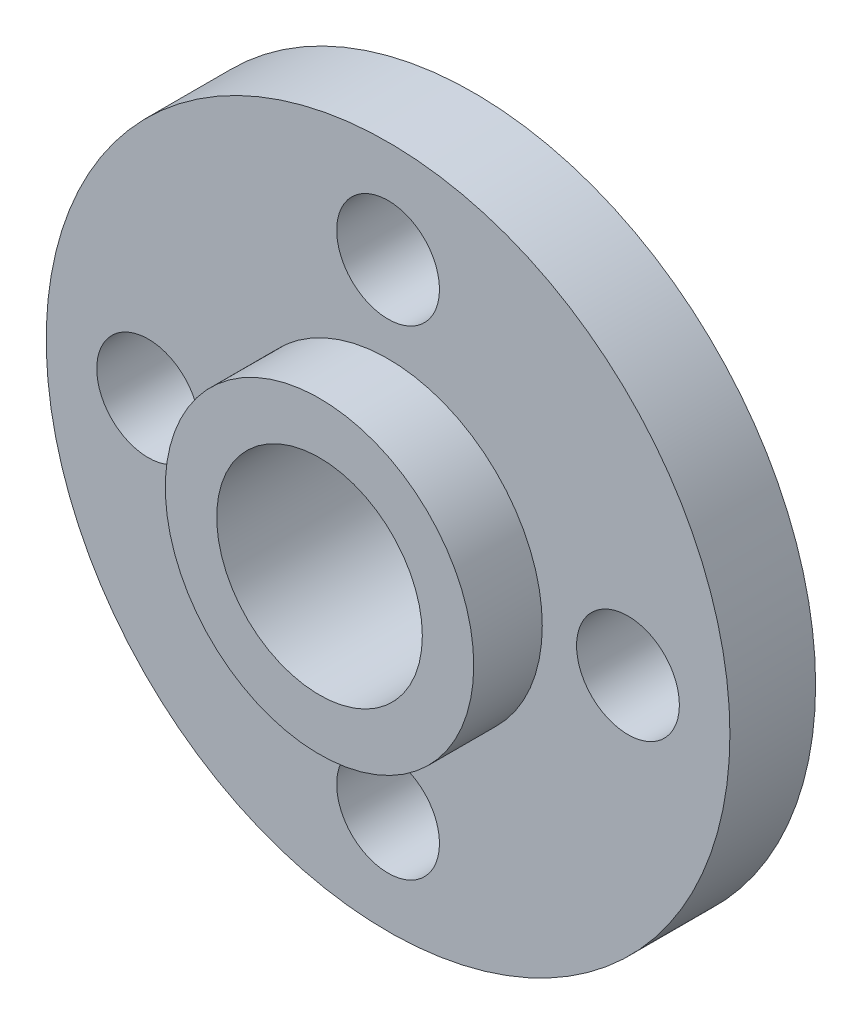
ISO-10303-21;
HEADER;
FILE_DESCRIPTION(('STEP AP214'),'2;1');
FILE_NAME('part.step','',(''),(''),'','','');
FILE_SCHEMA(('AUTOMOTIVE_DESIGN { 1 0 10303 214 1 1 1 1 }'));
ENDSEC;
DATA;
#1=APPLICATION_CONTEXT('core data for automotive mechanical design processes');
#2=APPLICATION_PROTOCOL_DEFINITION('international standard','automotive_design',2000,#1);
#3=PRODUCT_CONTEXT('',#1,'mechanical');
#4=PRODUCT('Part','Part','',(#3));
#5=PRODUCT_RELATED_PRODUCT_CATEGORY('part','',(#4));
#6=PRODUCT_DEFINITION_FORMATION('','',#4);
#7=PRODUCT_DEFINITION_CONTEXT('part definition',#1,'design');
#8=PRODUCT_DEFINITION('design','',#6,#7);
#9=PRODUCT_DEFINITION_SHAPE('','',#8);
#10=(LENGTH_UNIT() NAMED_UNIT(*) SI_UNIT(.MILLI.,.METRE.));
#11=(NAMED_UNIT(*) PLANE_ANGLE_UNIT() SI_UNIT($,.RADIAN.));
#12=(NAMED_UNIT(*) SI_UNIT($,.STERADIAN.) SOLID_ANGLE_UNIT());
#13=UNCERTAINTY_MEASURE_WITH_UNIT(LENGTH_MEASURE(1.E-05),#10,'distance_accuracy_value','');
#14=(GEOMETRIC_REPRESENTATION_CONTEXT(3) GLOBAL_UNCERTAINTY_ASSIGNED_CONTEXT((#13)) GLOBAL_UNIT_ASSIGNED_CONTEXT((#10,
#11,#12)) REPRESENTATION_CONTEXT('',''));
#15=CARTESIAN_POINT('',(0.,0.,0.));
#16=DIRECTION('',(0.,0.,1.));
#17=DIRECTION('',(1.,0.,0.));
#18=AXIS2_PLACEMENT_3D('',#15,#16,#17);
#19=CARTESIAN_POINT('',(0.,0.,2.5));
#20=DIRECTION('',(0.,0.,1.));
#21=DIRECTION('',(1.,0.,0.));
#22=AXIS2_PLACEMENT_3D('',#19,#20,#21);
#23=PLANE('',#22);
#24=CARTESIAN_POINT('',(0.,0.,2.5));
#25=DIRECTION('',(0.,0.,1.));
#26=DIRECTION('',(1.,0.,0.));
#27=AXIS2_PLACEMENT_3D('',#24,#25,#26);
#28=CIRCLE('',#27,4.5);
#29=CARTESIAN_POINT('',(4.5,0.,2.5));
#30=VERTEX_POINT('',#29);
#31=EDGE_CURVE('E72',#30,#30,#28,.T.);
#32=ORIENTED_EDGE('',*,*,#31,.F.);
#33=EDGE_LOOP('',(#32));
#34=FACE_BOUND('',#33,.T.);
#35=CARTESIAN_POINT('',(0.,-7.,2.5));
#36=DIRECTION('',(0.,0.,1.));
#37=DIRECTION('',(1.,0.,0.));
#38=AXIS2_PLACEMENT_3D('',#35,#36,#37);
#39=CIRCLE('',#38,1.5);
#40=CARTESIAN_POINT('',(1.5,-7.,2.5));
#41=VERTEX_POINT('',#40);
#42=EDGE_CURVE('E57',#41,#41,#39,.T.);
#43=ORIENTED_EDGE('',*,*,#42,.F.);
#44=EDGE_LOOP('',(#43));
#45=FACE_BOUND('',#44,.T.);
#46=CARTESIAN_POINT('',(0.,7.,2.5));
#47=DIRECTION('',(0.,0.,1.));
#48=DIRECTION('',(1.,0.,0.));
#49=AXIS2_PLACEMENT_3D('',#46,#47,#48);
#50=CIRCLE('',#49,1.5);
#51=CARTESIAN_POINT('',(1.5,7.,2.5));
#52=VERTEX_POINT('',#51);
#53=EDGE_CURVE('E46',#52,#52,#50,.T.);
#54=ORIENTED_EDGE('',*,*,#53,.F.);
#55=EDGE_LOOP('',(#54));
#56=FACE_BOUND('',#55,.T.);
#57=CARTESIAN_POINT('',(0.,0.,2.5));
#58=DIRECTION('',(0.,0.,1.));
#59=DIRECTION('',(1.,0.,0.));
#60=AXIS2_PLACEMENT_3D('',#57,#58,#59);
#61=CIRCLE('',#60,9.975);
#62=CARTESIAN_POINT('',(9.975,0.,2.5));
#63=VERTEX_POINT('',#62);
#64=EDGE_CURVE('E10',#63,#63,#61,.T.);
#65=ORIENTED_EDGE('',*,*,#64,.T.);
#66=EDGE_LOOP('',(#65));
#67=FACE_BOUND('',#66,.T.);
#68=CARTESIAN_POINT('',(7.,0.,2.5));
#69=DIRECTION('',(0.,0.,1.));
#70=DIRECTION('',(1.,0.,0.));
#71=AXIS2_PLACEMENT_3D('',#68,#69,#70);
#72=CIRCLE('',#71,1.5);
#73=CARTESIAN_POINT('',(8.5,0.,2.5));
#74=VERTEX_POINT('',#73);
#75=EDGE_CURVE('E51',#74,#74,#72,.T.);
#76=ORIENTED_EDGE('',*,*,#75,.F.);
#77=EDGE_LOOP('',(#76));
#78=FACE_BOUND('',#77,.T.);
#79=CARTESIAN_POINT('',(-7.,0.,2.5));
#80=DIRECTION('',(0.,0.,1.));
#81=DIRECTION('',(1.,0.,0.));
#82=AXIS2_PLACEMENT_3D('',#79,#80,#81);
#83=CIRCLE('',#82,1.5);
#84=CARTESIAN_POINT('',(-5.5,0.,2.5));
#85=VERTEX_POINT('',#84);
#86=EDGE_CURVE('E63',#85,#85,#83,.T.);
#87=ORIENTED_EDGE('',*,*,#86,.F.);
#88=EDGE_LOOP('',(#87));
#89=FACE_BOUND('',#88,.T.);
#90=ADVANCED_FACE('F35',(#34,#45,#56,#67,#78,#89),#23,.T.);
#91=CARTESIAN_POINT('',(0.,0.,0.));
#92=DIRECTION('',(0.,0.,1.));
#93=DIRECTION('',(1.,0.,0.));
#94=AXIS2_PLACEMENT_3D('',#91,#92,#93);
#95=PLANE('',#94);
#96=CARTESIAN_POINT('',(0.,0.,0.));
#97=DIRECTION('',(0.,0.,1.));
#98=DIRECTION('',(1.,0.,0.));
#99=AXIS2_PLACEMENT_3D('',#96,#97,#98);
#100=CIRCLE('',#99,3.);
#101=CARTESIAN_POINT('',(3.,0.,0.));
#102=VERTEX_POINT('',#101);
#103=EDGE_CURVE('E75',#102,#102,#100,.T.);
#104=ORIENTED_EDGE('',*,*,#103,.T.);
#105=EDGE_LOOP('',(#104));
#106=FACE_BOUND('',#105,.T.);
#107=CARTESIAN_POINT('',(0.,0.,0.));
#108=DIRECTION('',(0.,0.,1.));
#109=DIRECTION('',(1.,0.,0.));
#110=AXIS2_PLACEMENT_3D('',#107,#108,#109);
#111=CIRCLE('',#110,9.975);
#112=CARTESIAN_POINT('',(9.975,0.,0.));
#113=VERTEX_POINT('',#112);
#114=EDGE_CURVE('E39',#113,#113,#111,.T.);
#115=ORIENTED_EDGE('',*,*,#114,.F.);
#116=EDGE_LOOP('',(#115));
#117=FACE_BOUND('',#116,.T.);
#118=CARTESIAN_POINT('',(0.,7.,0.));
#119=DIRECTION('',(0.,0.,1.));
#120=DIRECTION('',(1.,0.,0.));
#121=AXIS2_PLACEMENT_3D('',#118,#119,#120);
#122=CIRCLE('',#121,1.5);
#123=CARTESIAN_POINT('',(1.5,7.,0.));
#124=VERTEX_POINT('',#123);
#125=EDGE_CURVE('E48',#124,#124,#122,.T.);
#126=ORIENTED_EDGE('',*,*,#125,.T.);
#127=EDGE_LOOP('',(#126));
#128=FACE_BOUND('',#127,.T.);
#129=CARTESIAN_POINT('',(7.,0.,0.));
#130=DIRECTION('',(0.,0.,1.));
#131=DIRECTION('',(1.,0.,0.));
#132=AXIS2_PLACEMENT_3D('',#129,#130,#131);
#133=CIRCLE('',#132,1.5);
#134=CARTESIAN_POINT('',(8.5,0.,0.));
#135=VERTEX_POINT('',#134);
#136=EDGE_CURVE('E54',#135,#135,#133,.T.);
#137=ORIENTED_EDGE('',*,*,#136,.T.);
#138=EDGE_LOOP('',(#137));
#139=FACE_BOUND('',#138,.T.);
#140=CARTESIAN_POINT('',(0.,-7.,0.));
#141=DIRECTION('',(0.,0.,1.));
#142=DIRECTION('',(1.,0.,0.));
#143=AXIS2_PLACEMENT_3D('',#140,#141,#142);
#144=CIRCLE('',#143,1.5);
#145=CARTESIAN_POINT('',(1.5,-7.,0.));
#146=VERTEX_POINT('',#145);
#147=EDGE_CURVE('E60',#146,#146,#144,.T.);
#148=ORIENTED_EDGE('',*,*,#147,.T.);
#149=EDGE_LOOP('',(#148));
#150=FACE_BOUND('',#149,.T.);
#151=CARTESIAN_POINT('',(-7.,0.,0.));
#152=DIRECTION('',(0.,0.,1.));
#153=DIRECTION('',(1.,0.,0.));
#154=AXIS2_PLACEMENT_3D('',#151,#152,#153);
#155=CIRCLE('',#154,1.5);
#156=CARTESIAN_POINT('',(-5.5,0.,0.));
#157=VERTEX_POINT('',#156);
#158=EDGE_CURVE('E66',#157,#157,#155,.T.);
#159=ORIENTED_EDGE('',*,*,#158,.T.);
#160=EDGE_LOOP('',(#159));
#161=FACE_BOUND('',#160,.T.);
#162=ADVANCED_FACE('F84',(#106,#117,#128,#139,#150,#161),#95,.F.);
#163=CARTESIAN_POINT('',(0.,0.,2.5));
#164=DIRECTION('',(0.,0.,-1.));
#165=DIRECTION('',(-1.,0.,0.));
#166=AXIS2_PLACEMENT_3D('',#163,#164,#165);
#167=CYLINDRICAL_SURFACE('',#166,9.975);
#168=ORIENTED_EDGE('',*,*,#64,.F.);
#169=EDGE_LOOP('',(#168));
#170=FACE_BOUND('',#169,.T.);
#171=ORIENTED_EDGE('',*,*,#114,.T.);
#172=EDGE_LOOP('',(#171));
#173=FACE_BOUND('',#172,.T.);
#174=ADVANCED_FACE('F37',(#170,#173),#167,.T.);
#175=CARTESIAN_POINT('',(0.,7.,2.5));
#176=DIRECTION('',(0.,0.,-1.));
#177=DIRECTION('',(-1.,0.,0.));
#178=AXIS2_PLACEMENT_3D('',#175,#176,#177);
#179=CYLINDRICAL_SURFACE('',#178,1.5);
#180=ORIENTED_EDGE('',*,*,#53,.T.);
#181=EDGE_LOOP('',(#180));
#182=FACE_BOUND('',#181,.T.);
#183=ORIENTED_EDGE('',*,*,#125,.F.);
#184=EDGE_LOOP('',(#183));
#185=FACE_BOUND('',#184,.T.);
#186=ADVANCED_FACE('F127',(#182,#185),#179,.F.);
#187=CARTESIAN_POINT('',(7.,0.,2.5));
#188=DIRECTION('',(0.,0.,-1.));
#189=DIRECTION('',(-1.,0.,0.));
#190=AXIS2_PLACEMENT_3D('',#187,#188,#189);
#191=CYLINDRICAL_SURFACE('',#190,1.5);
#192=ORIENTED_EDGE('',*,*,#75,.T.);
#193=EDGE_LOOP('',(#192));
#194=FACE_BOUND('',#193,.T.);
#195=ORIENTED_EDGE('',*,*,#136,.F.);
#196=EDGE_LOOP('',(#195));
#197=FACE_BOUND('',#196,.T.);
#198=ADVANCED_FACE('F132',(#194,#197),#191,.F.);
#199=CARTESIAN_POINT('',(0.,-7.,2.5));
#200=DIRECTION('',(0.,0.,-1.));
#201=DIRECTION('',(-1.,0.,0.));
#202=AXIS2_PLACEMENT_3D('',#199,#200,#201);
#203=CYLINDRICAL_SURFACE('',#202,1.5);
#204=ORIENTED_EDGE('',*,*,#42,.T.);
#205=EDGE_LOOP('',(#204));
#206=FACE_BOUND('',#205,.T.);
#207=ORIENTED_EDGE('',*,*,#147,.F.);
#208=EDGE_LOOP('',(#207));
#209=FACE_BOUND('',#208,.T.);
#210=ADVANCED_FACE('F119',(#206,#209),#203,.F.);
#211=CARTESIAN_POINT('',(-7.,0.,2.5));
#212=DIRECTION('',(0.,0.,-1.));
#213=DIRECTION('',(-1.,0.,0.));
#214=AXIS2_PLACEMENT_3D('',#211,#212,#213);
#215=CYLINDRICAL_SURFACE('',#214,1.5);
#216=ORIENTED_EDGE('',*,*,#86,.T.);
#217=EDGE_LOOP('',(#216));
#218=FACE_BOUND('',#217,.T.);
#219=ORIENTED_EDGE('',*,*,#158,.F.);
#220=EDGE_LOOP('',(#219));
#221=FACE_BOUND('',#220,.T.);
#222=ADVANCED_FACE('F102',(#218,#221),#215,.F.);
#223=CARTESIAN_POINT('',(0.,0.,4.5));
#224=DIRECTION('',(0.,0.,-1.));
#225=DIRECTION('',(-1.,0.,0.));
#226=AXIS2_PLACEMENT_3D('',#223,#224,#225);
#227=CYLINDRICAL_SURFACE('',#226,4.5);
#228=CARTESIAN_POINT('',(0.,0.,4.5));
#229=DIRECTION('',(0.,0.,1.));
#230=DIRECTION('',(1.,0.,0.));
#231=AXIS2_PLACEMENT_3D('',#228,#229,#230);
#232=CIRCLE('',#231,4.5);
#233=CARTESIAN_POINT('',(4.5,0.,4.5));
#234=VERTEX_POINT('',#233);
#235=EDGE_CURVE('E69',#234,#234,#232,.T.);
#236=ORIENTED_EDGE('',*,*,#235,.F.);
#237=EDGE_LOOP('',(#236));
#238=FACE_BOUND('',#237,.T.);
#239=ORIENTED_EDGE('',*,*,#31,.T.);
#240=EDGE_LOOP('',(#239));
#241=FACE_BOUND('',#240,.T.);
#242=ADVANCED_FACE('F96',(#238,#241),#227,.T.);
#243=CARTESIAN_POINT('',(0.,0.,4.5));
#244=DIRECTION('',(0.,0.,1.));
#245=DIRECTION('',(1.,0.,0.));
#246=AXIS2_PLACEMENT_3D('',#243,#244,#245);
#247=PLANE('',#246);
#248=CARTESIAN_POINT('',(0.,0.,4.5));
#249=DIRECTION('',(0.,0.,1.));
#250=DIRECTION('',(1.,0.,0.));
#251=AXIS2_PLACEMENT_3D('',#248,#249,#250);
#252=CIRCLE('',#251,3.);
#253=CARTESIAN_POINT('',(3.,0.,4.5));
#254=VERTEX_POINT('',#253);
#255=EDGE_CURVE('E78',#254,#254,#252,.T.);
#256=ORIENTED_EDGE('',*,*,#255,.F.);
#257=EDGE_LOOP('',(#256));
#258=FACE_BOUND('',#257,.T.);
#259=ORIENTED_EDGE('',*,*,#235,.T.);
#260=EDGE_LOOP('',(#259));
#261=FACE_BOUND('',#260,.T.);
#262=ADVANCED_FACE('F90',(#258,#261),#247,.T.);
#263=CARTESIAN_POINT('',(0.,0.,0.));
#264=DIRECTION('',(0.,0.,1.));
#265=DIRECTION('',(1.,0.,0.));
#266=AXIS2_PLACEMENT_3D('',#263,#264,#265);
#267=CYLINDRICAL_SURFACE('',#266,3.);
#268=ORIENTED_EDGE('',*,*,#103,.F.);
#269=EDGE_LOOP('',(#268));
#270=FACE_BOUND('',#269,.T.);
#271=ORIENTED_EDGE('',*,*,#255,.T.);
#272=EDGE_LOOP('',(#271));
#273=FACE_BOUND('',#272,.T.);
#274=ADVANCED_FACE('F87',(#270,#273),#267,.F.);
#275=CLOSED_SHELL('',(#90,#162,#174,#186,#198,#210,#222,#242,#262,#274));
#276=MANIFOLD_SOLID_BREP('B2',#275);
#277=ADVANCED_BREP_SHAPE_REPRESENTATION('',(#18,#276),#14);
#278=SHAPE_DEFINITION_REPRESENTATION(#9,#277);
ENDSEC;
END-ISO-10303-21;
